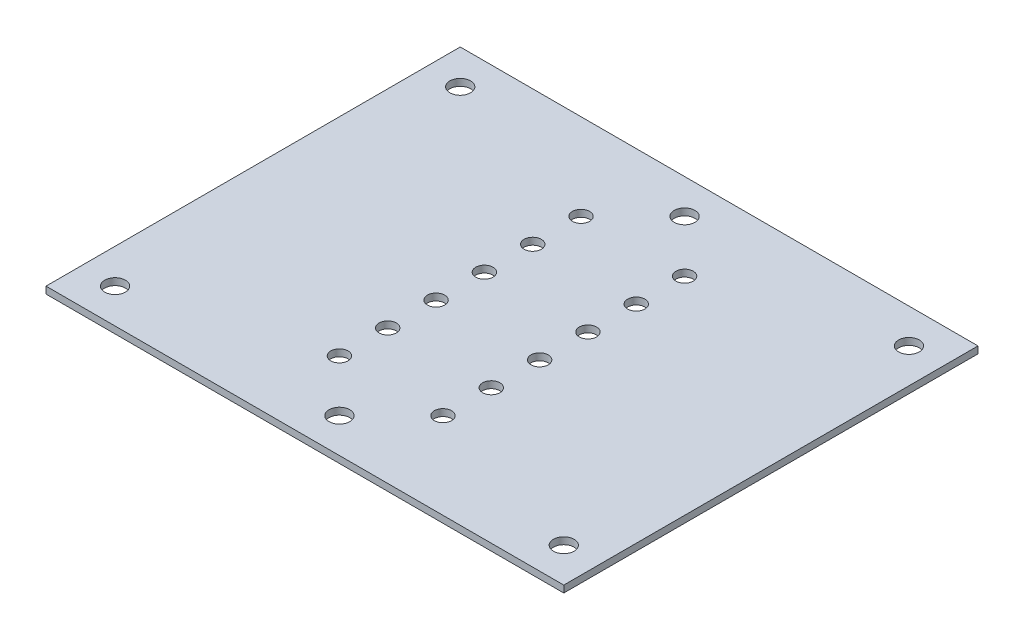
ISO-10303-21;
HEADER;
FILE_DESCRIPTION(('STEP AP214'),'2;1');
FILE_NAME('part.step','',(''),(''),'','','');
FILE_SCHEMA(('AUTOMOTIVE_DESIGN { 1 0 10303 214 1 1 1 1 }'));
ENDSEC;
DATA;
#1=APPLICATION_CONTEXT('core data for automotive mechanical design processes');
#2=APPLICATION_PROTOCOL_DEFINITION('international standard','automotive_design',2000,#1);
#3=PRODUCT_CONTEXT('',#1,'mechanical');
#4=PRODUCT('Part','Part','',(#3));
#5=PRODUCT_RELATED_PRODUCT_CATEGORY('part','',(#4));
#6=PRODUCT_DEFINITION_FORMATION('','',#4);
#7=PRODUCT_DEFINITION_CONTEXT('part definition',#1,'design');
#8=PRODUCT_DEFINITION('design','',#6,#7);
#9=PRODUCT_DEFINITION_SHAPE('','',#8);
#10=(LENGTH_UNIT() NAMED_UNIT(*) SI_UNIT(.MILLI.,.METRE.));
#11=(NAMED_UNIT(*) PLANE_ANGLE_UNIT() SI_UNIT($,.RADIAN.));
#12=(NAMED_UNIT(*) SI_UNIT($,.STERADIAN.) SOLID_ANGLE_UNIT());
#13=UNCERTAINTY_MEASURE_WITH_UNIT(LENGTH_MEASURE(1.E-05),#10,'distance_accuracy_value','');
#14=(GEOMETRIC_REPRESENTATION_CONTEXT(3) GLOBAL_UNCERTAINTY_ASSIGNED_CONTEXT((#13)) GLOBAL_UNIT_ASSIGNED_CONTEXT((#10,
#11,#12)) REPRESENTATION_CONTEXT('',''));
#15=CARTESIAN_POINT('',(0.,0.,0.));
#16=DIRECTION('',(0.,0.,1.));
#17=DIRECTION('',(1.,0.,0.));
#18=AXIS2_PLACEMENT_3D('',#15,#16,#17);
#19=CARTESIAN_POINT('',(37.5,1.,30.));
#20=DIRECTION('',(-1.,0.,0.));
#21=DIRECTION('',(0.,0.,1.));
#22=AXIS2_PLACEMENT_3D('',#19,#20,#21);
#23=PLANE('',#22);
#24=DIRECTION('',(0.,0.,-1.));
#25=VECTOR('',#24,1.);
#26=CARTESIAN_POINT('',(37.5,0.,30.));
#27=LINE('',#26,#25);
#28=CARTESIAN_POINT('',(37.5,0.,30.));
#29=VERTEX_POINT('',#28);
#30=CARTESIAN_POINT('',(37.5,0.,-30.));
#31=VERTEX_POINT('',#30);
#32=EDGE_CURVE('E97',#29,#31,#27,.T.);
#33=ORIENTED_EDGE('',*,*,#32,.T.);
#34=DIRECTION('',(0.,-1.,0.));
#35=VECTOR('',#34,1.);
#36=CARTESIAN_POINT('',(37.5,1.,-30.));
#37=LINE('',#36,#35);
#38=CARTESIAN_POINT('',(37.5,1.,-30.));
#39=VERTEX_POINT('',#38);
#40=EDGE_CURVE('E11',#39,#31,#37,.T.);
#41=ORIENTED_EDGE('',*,*,#40,.F.);
#42=DIRECTION('',(0.,0.,-1.));
#43=VECTOR('',#42,1.);
#44=CARTESIAN_POINT('',(37.5,1.,30.));
#45=LINE('',#44,#43);
#46=CARTESIAN_POINT('',(37.5,1.,30.));
#47=VERTEX_POINT('',#46);
#48=EDGE_CURVE('E85',#47,#39,#45,.T.);
#49=ORIENTED_EDGE('',*,*,#48,.F.);
#50=DIRECTION('',(0.,-1.,0.));
#51=VECTOR('',#50,1.);
#52=CARTESIAN_POINT('',(37.5,1.,30.));
#53=LINE('',#52,#51);
#54=EDGE_CURVE('E93',#47,#29,#53,.T.);
#55=ORIENTED_EDGE('',*,*,#54,.T.);
#56=EDGE_LOOP('',(#33,#41,#49,#55));
#57=FACE_BOUND('',#56,.T.);
#58=ADVANCED_FACE('F34',(#57),#23,.F.);
#59=CARTESIAN_POINT('',(-37.5,1.,-30.));
#60=DIRECTION('',(0.,0.,1.));
#61=DIRECTION('',(1.,0.,0.));
#62=AXIS2_PLACEMENT_3D('',#59,#60,#61);
#63=PLANE('',#62);
#64=DIRECTION('',(-1.,0.,0.));
#65=VECTOR('',#64,1.);
#66=CARTESIAN_POINT('',(-37.5,0.,-30.));
#67=LINE('',#66,#65);
#68=CARTESIAN_POINT('',(-37.5,0.,-30.));
#69=VERTEX_POINT('',#68);
#70=EDGE_CURVE('E89',#31,#69,#67,.T.);
#71=ORIENTED_EDGE('',*,*,#70,.T.);
#72=DIRECTION('',(0.,-1.,0.));
#73=VECTOR('',#72,1.);
#74=CARTESIAN_POINT('',(-37.5,1.,-30.));
#75=LINE('',#74,#73);
#76=CARTESIAN_POINT('',(-37.5,1.,-30.));
#77=VERTEX_POINT('',#76);
#78=EDGE_CURVE('E42',#77,#69,#75,.T.);
#79=ORIENTED_EDGE('',*,*,#78,.F.);
#80=DIRECTION('',(-1.,0.,0.));
#81=VECTOR('',#80,1.);
#82=CARTESIAN_POINT('',(-37.5,1.,-30.));
#83=LINE('',#82,#81);
#84=EDGE_CURVE('E80',#39,#77,#83,.T.);
#85=ORIENTED_EDGE('',*,*,#84,.F.);
#86=ORIENTED_EDGE('',*,*,#40,.T.);
#87=EDGE_LOOP('',(#71,#79,#85,#86));
#88=FACE_BOUND('',#87,.T.);
#89=ADVANCED_FACE('F88',(#88),#63,.F.);
#90=CARTESIAN_POINT('',(-37.5,1.,30.));
#91=DIRECTION('',(1.,0.,0.));
#92=DIRECTION('',(0.,0.,-1.));
#93=AXIS2_PLACEMENT_3D('',#90,#91,#92);
#94=PLANE('',#93);
#95=DIRECTION('',(0.,0.,1.));
#96=VECTOR('',#95,1.);
#97=CARTESIAN_POINT('',(-37.5,0.,30.));
#98=LINE('',#97,#96);
#99=CARTESIAN_POINT('',(-37.5,0.,30.));
#100=VERTEX_POINT('',#99);
#101=EDGE_CURVE('E67',#69,#100,#98,.T.);
#102=ORIENTED_EDGE('',*,*,#101,.T.);
#103=DIRECTION('',(0.,-1.,0.));
#104=VECTOR('',#103,1.);
#105=CARTESIAN_POINT('',(-37.5,1.,30.));
#106=LINE('',#105,#104);
#107=CARTESIAN_POINT('',(-37.5,1.,30.));
#108=VERTEX_POINT('',#107);
#109=EDGE_CURVE('E90',#108,#100,#106,.T.);
#110=ORIENTED_EDGE('',*,*,#109,.F.);
#111=DIRECTION('',(0.,0.,1.));
#112=VECTOR('',#111,1.);
#113=CARTESIAN_POINT('',(-37.5,1.,30.));
#114=LINE('',#113,#112);
#115=EDGE_CURVE('E83',#77,#108,#114,.T.);
#116=ORIENTED_EDGE('',*,*,#115,.F.);
#117=ORIENTED_EDGE('',*,*,#78,.T.);
#118=EDGE_LOOP('',(#102,#110,#116,#117));
#119=FACE_BOUND('',#118,.T.);
#120=ADVANCED_FACE('F91',(#119),#94,.F.);
#121=CARTESIAN_POINT('',(-37.5,1.,30.));
#122=DIRECTION('',(0.,0.,-1.));
#123=DIRECTION('',(-1.,0.,0.));
#124=AXIS2_PLACEMENT_3D('',#121,#122,#123);
#125=PLANE('',#124);
#126=DIRECTION('',(1.,0.,0.));
#127=VECTOR('',#126,1.);
#128=CARTESIAN_POINT('',(-37.5,0.,30.));
#129=LINE('',#128,#127);
#130=EDGE_CURVE('E73',#100,#29,#129,.T.);
#131=ORIENTED_EDGE('',*,*,#130,.T.);
#132=ORIENTED_EDGE('',*,*,#54,.F.);
#133=DIRECTION('',(1.,0.,0.));
#134=VECTOR('',#133,1.);
#135=CARTESIAN_POINT('',(-37.5,1.,30.));
#136=LINE('',#135,#134);
#137=EDGE_CURVE('E50',#108,#47,#136,.T.);
#138=ORIENTED_EDGE('',*,*,#137,.F.);
#139=ORIENTED_EDGE('',*,*,#109,.T.);
#140=EDGE_LOOP('',(#131,#132,#138,#139));
#141=FACE_BOUND('',#140,.T.);
#142=ADVANCED_FACE('F105',(#141),#125,.F.);
#143=CARTESIAN_POINT('',(0.,1.,0.));
#144=DIRECTION('',(0.,-1.,0.));
#145=DIRECTION('',(0.,0.,-1.));
#146=AXIS2_PLACEMENT_3D('',#143,#144,#145);
#147=PLANE('',#146);
#148=CARTESIAN_POINT('',(32.5,1.,25.));
#149=DIRECTION('',(0.,1.,0.));
#150=DIRECTION('',(0.,0.,1.));
#151=AXIS2_PLACEMENT_3D('',#148,#149,#150);
#152=CIRCLE('',#151,1.5);
#153=CARTESIAN_POINT('',(32.5,1.,26.5));
#154=VERTEX_POINT('',#153);
#155=EDGE_CURVE('E186',#154,#154,#152,.T.);
#156=ORIENTED_EDGE('',*,*,#155,.F.);
#157=EDGE_LOOP('',(#156));
#158=FACE_BOUND('',#157,.T.);
#159=CARTESIAN_POINT('',(-32.5,1.,25.));
#160=DIRECTION('',(0.,1.,0.));
#161=DIRECTION('',(0.,0.,-1.));
#162=AXIS2_PLACEMENT_3D('',#159,#160,#161);
#163=CIRCLE('',#162,1.5);
#164=CARTESIAN_POINT('',(-32.5,1.,23.5));
#165=VERTEX_POINT('',#164);
#166=EDGE_CURVE('E205',#165,#165,#163,.T.);
#167=ORIENTED_EDGE('',*,*,#166,.F.);
#168=EDGE_LOOP('',(#167));
#169=FACE_BOUND('',#168,.T.);
#170=CARTESIAN_POINT('',(32.5,1.,-25.));
#171=DIRECTION('',(0.,1.,0.));
#172=DIRECTION('',(0.,0.,-1.));
#173=AXIS2_PLACEMENT_3D('',#170,#171,#172);
#174=CIRCLE('',#173,1.5);
#175=CARTESIAN_POINT('',(32.5,1.,-26.5));
#176=VERTEX_POINT('',#175);
#177=EDGE_CURVE('E199',#176,#176,#174,.T.);
#178=ORIENTED_EDGE('',*,*,#177,.F.);
#179=EDGE_LOOP('',(#178));
#180=FACE_BOUND('',#179,.T.);
#181=CARTESIAN_POINT('',(0.,1.,-25.));
#182=DIRECTION('',(0.,1.,0.));
#183=DIRECTION('',(0.,0.,1.));
#184=AXIS2_PLACEMENT_3D('',#181,#182,#183);
#185=CIRCLE('',#184,1.5);
#186=CARTESIAN_POINT('',(0.,1.,-23.5));
#187=VERTEX_POINT('',#186);
#188=EDGE_CURVE('E192',#187,#187,#185,.T.);
#189=ORIENTED_EDGE('',*,*,#188,.F.);
#190=EDGE_LOOP('',(#189));
#191=FACE_BOUND('',#190,.T.);
#192=CARTESIAN_POINT('',(0.,1.,25.));
#193=DIRECTION('',(0.,1.,0.));
#194=DIRECTION('',(0.,0.,-1.));
#195=AXIS2_PLACEMENT_3D('',#192,#193,#194);
#196=CIRCLE('',#195,1.5);
#197=CARTESIAN_POINT('',(0.,1.,23.5));
#198=VERTEX_POINT('',#197);
#199=EDGE_CURVE('E193',#198,#198,#196,.T.);
#200=ORIENTED_EDGE('',*,*,#199,.F.);
#201=EDGE_LOOP('',(#200));
#202=FACE_BOUND('',#201,.T.);
#203=CARTESIAN_POINT('',(-32.5,1.,-25.));
#204=DIRECTION('',(0.,1.,0.));
#205=DIRECTION('',(0.,0.,1.));
#206=AXIS2_PLACEMENT_3D('',#203,#204,#205);
#207=CIRCLE('',#206,1.5);
#208=CARTESIAN_POINT('',(-32.5,1.,-23.5));
#209=VERTEX_POINT('',#208);
#210=EDGE_CURVE('E169',#209,#209,#207,.T.);
#211=ORIENTED_EDGE('',*,*,#210,.F.);
#212=EDGE_LOOP('',(#211));
#213=FACE_BOUND('',#212,.T.);
#214=CARTESIAN_POINT('',(-7.49999999999985,1.,-3.5));
#215=DIRECTION('',(0.,1.,0.));
#216=DIRECTION('',(0.,0.,1.));
#217=AXIS2_PLACEMENT_3D('',#214,#215,#216);
#218=CIRCLE('',#217,1.25);
#219=CARTESIAN_POINT('',(-7.49999999999985,1.,-2.25));
#220=VERTEX_POINT('',#219);
#221=EDGE_CURVE('E144',#220,#220,#218,.T.);
#222=ORIENTED_EDGE('',*,*,#221,.F.);
#223=EDGE_LOOP('',(#222));
#224=FACE_BOUND('',#223,.T.);
#225=CARTESIAN_POINT('',(-7.49999999999993,1.,-10.5));
#226=DIRECTION('',(0.,1.,0.));
#227=DIRECTION('',(0.,0.,1.));
#228=AXIS2_PLACEMENT_3D('',#225,#226,#227);
#229=CIRCLE('',#228,1.25);
#230=CARTESIAN_POINT('',(-7.49999999999993,1.,-9.25));
#231=VERTEX_POINT('',#230);
#232=EDGE_CURVE('E151',#231,#231,#229,.T.);
#233=ORIENTED_EDGE('',*,*,#232,.F.);
#234=EDGE_LOOP('',(#233));
#235=FACE_BOUND('',#234,.T.);
#236=CARTESIAN_POINT('',(7.50000000000034,1.,17.4999999999998));
#237=DIRECTION('',(0.,1.,0.));
#238=DIRECTION('',(0.,0.,1.));
#239=AXIS2_PLACEMENT_3D('',#236,#237,#238);
#240=CIRCLE('',#239,1.25000000000001);
#241=CARTESIAN_POINT('',(7.50000000000034,1.,18.7499999999998));
#242=VERTEX_POINT('',#241);
#243=EDGE_CURVE('E157',#242,#242,#240,.T.);
#244=ORIENTED_EDGE('',*,*,#243,.F.);
#245=EDGE_LOOP('',(#244));
#246=FACE_BOUND('',#245,.T.);
#247=CARTESIAN_POINT('',(7.50000000000028,1.,10.4999999999998));
#248=DIRECTION('',(0.,1.,0.));
#249=DIRECTION('',(0.,0.,1.));
#250=AXIS2_PLACEMENT_3D('',#247,#248,#249);
#251=CIRCLE('',#250,1.25000000000001);
#252=CARTESIAN_POINT('',(7.50000000000028,1.,11.7499999999998));
#253=VERTEX_POINT('',#252);
#254=EDGE_CURVE('E121',#253,#253,#251,.T.);
#255=ORIENTED_EDGE('',*,*,#254,.F.);
#256=EDGE_LOOP('',(#255));
#257=FACE_BOUND('',#256,.T.);
#258=CARTESIAN_POINT('',(7.5000000000002,1.,3.49999999999979));
#259=DIRECTION('',(0.,1.,0.));
#260=DIRECTION('',(0.,0.,1.));
#261=AXIS2_PLACEMENT_3D('',#258,#259,#260);
#262=CIRCLE('',#261,1.25000000000001);
#263=CARTESIAN_POINT('',(7.5000000000002,1.,4.7499999999998));
#264=VERTEX_POINT('',#263);
#265=EDGE_CURVE('E120',#264,#264,#262,.T.);
#266=ORIENTED_EDGE('',*,*,#265,.F.);
#267=EDGE_LOOP('',(#266));
#268=FACE_BOUND('',#267,.T.);
#269=CARTESIAN_POINT('',(7.50000000000015,1.,-3.50000000000021));
#270=DIRECTION('',(0.,1.,0.));
#271=DIRECTION('',(0.,0.,1.));
#272=AXIS2_PLACEMENT_3D('',#269,#270,#271);
#273=CIRCLE('',#272,1.25000000000001);
#274=CARTESIAN_POINT('',(7.50000000000015,1.,-2.2500000000002));
#275=VERTEX_POINT('',#274);
#276=EDGE_CURVE('E127',#275,#275,#273,.T.);
#277=ORIENTED_EDGE('',*,*,#276,.F.);
#278=EDGE_LOOP('',(#277));
#279=FACE_BOUND('',#278,.T.);
#280=CARTESIAN_POINT('',(7.50000000000006,1.,-10.5000000000002));
#281=DIRECTION('',(0.,1.,0.));
#282=DIRECTION('',(0.,0.,1.));
#283=AXIS2_PLACEMENT_3D('',#280,#281,#282);
#284=CIRCLE('',#283,1.25000000000001);
#285=CARTESIAN_POINT('',(7.50000000000006,1.,-9.2500000000002));
#286=VERTEX_POINT('',#285);
#287=EDGE_CURVE('E133',#286,#286,#284,.T.);
#288=ORIENTED_EDGE('',*,*,#287,.F.);
#289=EDGE_LOOP('',(#288));
#290=FACE_BOUND('',#289,.T.);
#291=CARTESIAN_POINT('',(7.49999999999998,1.,-17.5000000000002));
#292=DIRECTION('',(0.,1.,0.));
#293=DIRECTION('',(0.,0.,1.));
#294=AXIS2_PLACEMENT_3D('',#291,#292,#293);
#295=CIRCLE('',#294,1.25000000000001);
#296=CARTESIAN_POINT('',(7.49999999999998,1.,-16.2500000000002));
#297=VERTEX_POINT('',#296);
#298=EDGE_CURVE('E114',#297,#297,#295,.T.);
#299=ORIENTED_EDGE('',*,*,#298,.F.);
#300=EDGE_LOOP('',(#299));
#301=FACE_BOUND('',#300,.T.);
#302=CARTESIAN_POINT('',(-7.49999999999978,1.,3.5));
#303=DIRECTION('',(0.,1.,0.));
#304=DIRECTION('',(0.,0.,1.));
#305=AXIS2_PLACEMENT_3D('',#302,#303,#304);
#306=CIRCLE('',#305,1.25);
#307=CARTESIAN_POINT('',(-7.49999999999978,1.,4.75));
#308=VERTEX_POINT('',#307);
#309=EDGE_CURVE('E145',#308,#308,#306,.T.);
#310=ORIENTED_EDGE('',*,*,#309,.F.);
#311=EDGE_LOOP('',(#310));
#312=FACE_BOUND('',#311,.T.);
#313=CARTESIAN_POINT('',(-7.49999999999971,1.,10.5));
#314=DIRECTION('',(0.,1.,0.));
#315=DIRECTION('',(0.,0.,1.));
#316=AXIS2_PLACEMENT_3D('',#313,#314,#315);
#317=CIRCLE('',#316,1.25);
#318=CARTESIAN_POINT('',(-7.49999999999971,1.,11.75));
#319=VERTEX_POINT('',#318);
#320=EDGE_CURVE('E175',#319,#319,#317,.T.);
#321=ORIENTED_EDGE('',*,*,#320,.F.);
#322=EDGE_LOOP('',(#321));
#323=FACE_BOUND('',#322,.T.);
#324=CARTESIAN_POINT('',(-7.49999999999963,1.,17.5));
#325=DIRECTION('',(0.,1.,0.));
#326=DIRECTION('',(0.,0.,1.));
#327=AXIS2_PLACEMENT_3D('',#324,#325,#326);
#328=CIRCLE('',#327,1.25);
#329=CARTESIAN_POINT('',(-7.49999999999963,1.,18.75));
#330=VERTEX_POINT('',#329);
#331=EDGE_CURVE('E168',#330,#330,#328,.T.);
#332=ORIENTED_EDGE('',*,*,#331,.F.);
#333=EDGE_LOOP('',(#332));
#334=FACE_BOUND('',#333,.T.);
#335=CARTESIAN_POINT('',(-7.5,1.,-17.5));
#336=DIRECTION('',(0.,1.,0.));
#337=DIRECTION('',(0.,0.,1.));
#338=AXIS2_PLACEMENT_3D('',#335,#336,#337);
#339=CIRCLE('',#338,1.25);
#340=CARTESIAN_POINT('',(-7.5,1.,-16.25));
#341=VERTEX_POINT('',#340);
#342=EDGE_CURVE('E100',#341,#341,#339,.T.);
#343=ORIENTED_EDGE('',*,*,#342,.F.);
#344=EDGE_LOOP('',(#343));
#345=FACE_BOUND('',#344,.T.);
#346=ORIENTED_EDGE('',*,*,#48,.T.);
#347=ORIENTED_EDGE('',*,*,#84,.T.);
#348=ORIENTED_EDGE('',*,*,#115,.T.);
#349=ORIENTED_EDGE('',*,*,#137,.T.);
#350=EDGE_LOOP('',(#346,#347,#348,#349));
#351=FACE_BOUND('',#350,.T.);
#352=ADVANCED_FACE('F81',(#158,#169,#180,#191,#202,#213,#224,#235,#246,#257,#268,#279,#290,#301,
#312,#323,#334,#345,#351),#147,.F.);
#353=CARTESIAN_POINT('',(0.,0.,0.));
#354=DIRECTION('',(0.,-1.,0.));
#355=DIRECTION('',(0.,0.,-1.));
#356=AXIS2_PLACEMENT_3D('',#353,#354,#355);
#357=PLANE('',#356);
#358=CARTESIAN_POINT('',(32.5,0.,25.));
#359=DIRECTION('',(0.,1.,0.));
#360=DIRECTION('',(0.,0.,1.));
#361=AXIS2_PLACEMENT_3D('',#358,#359,#360);
#362=CIRCLE('',#361,1.5);
#363=CARTESIAN_POINT('',(32.5,0.,26.5));
#364=VERTEX_POINT('',#363);
#365=EDGE_CURVE('E208',#364,#364,#362,.T.);
#366=ORIENTED_EDGE('',*,*,#365,.T.);
#367=EDGE_LOOP('',(#366));
#368=FACE_BOUND('',#367,.T.);
#369=CARTESIAN_POINT('',(-32.5,0.,25.));
#370=DIRECTION('',(0.,1.,0.));
#371=DIRECTION('',(0.,0.,-1.));
#372=AXIS2_PLACEMENT_3D('',#369,#370,#371);
#373=CIRCLE('',#372,1.5);
#374=CARTESIAN_POINT('',(-32.5,0.,23.5));
#375=VERTEX_POINT('',#374);
#376=EDGE_CURVE('E202',#375,#375,#373,.T.);
#377=ORIENTED_EDGE('',*,*,#376,.T.);
#378=EDGE_LOOP('',(#377));
#379=FACE_BOUND('',#378,.T.);
#380=CARTESIAN_POINT('',(32.5,0.,-25.));
#381=DIRECTION('',(0.,1.,0.));
#382=DIRECTION('',(0.,0.,-1.));
#383=AXIS2_PLACEMENT_3D('',#380,#381,#382);
#384=CIRCLE('',#383,1.5);
#385=CARTESIAN_POINT('',(32.5,0.,-26.5));
#386=VERTEX_POINT('',#385);
#387=EDGE_CURVE('E196',#386,#386,#384,.T.);
#388=ORIENTED_EDGE('',*,*,#387,.T.);
#389=EDGE_LOOP('',(#388));
#390=FACE_BOUND('',#389,.T.);
#391=CARTESIAN_POINT('',(0.,0.,-25.));
#392=DIRECTION('',(0.,1.,0.));
#393=DIRECTION('',(0.,0.,1.));
#394=AXIS2_PLACEMENT_3D('',#391,#392,#393);
#395=CIRCLE('',#394,1.5);
#396=CARTESIAN_POINT('',(0.,0.,-23.5));
#397=VERTEX_POINT('',#396);
#398=EDGE_CURVE('E189',#397,#397,#395,.T.);
#399=ORIENTED_EDGE('',*,*,#398,.T.);
#400=EDGE_LOOP('',(#399));
#401=FACE_BOUND('',#400,.T.);
#402=CARTESIAN_POINT('',(0.,0.,25.));
#403=DIRECTION('',(0.,1.,0.));
#404=DIRECTION('',(0.,0.,-1.));
#405=AXIS2_PLACEMENT_3D('',#402,#403,#404);
#406=CIRCLE('',#405,1.5);
#407=CARTESIAN_POINT('',(0.,0.,23.5));
#408=VERTEX_POINT('',#407);
#409=EDGE_CURVE('E213',#408,#408,#406,.T.);
#410=ORIENTED_EDGE('',*,*,#409,.T.);
#411=EDGE_LOOP('',(#410));
#412=FACE_BOUND('',#411,.T.);
#413=CARTESIAN_POINT('',(-32.5,0.,-25.));
#414=DIRECTION('',(0.,1.,0.));
#415=DIRECTION('',(0.,0.,1.));
#416=AXIS2_PLACEMENT_3D('',#413,#414,#415);
#417=CIRCLE('',#416,1.5);
#418=CARTESIAN_POINT('',(-32.5,0.,-23.5));
#419=VERTEX_POINT('',#418);
#420=EDGE_CURVE('E183',#419,#419,#417,.T.);
#421=ORIENTED_EDGE('',*,*,#420,.T.);
#422=EDGE_LOOP('',(#421));
#423=FACE_BOUND('',#422,.T.);
#424=CARTESIAN_POINT('',(-7.49999999999985,0.,-3.5));
#425=DIRECTION('',(0.,1.,0.));
#426=DIRECTION('',(0.,0.,1.));
#427=AXIS2_PLACEMENT_3D('',#424,#425,#426);
#428=CIRCLE('',#427,1.25);
#429=CARTESIAN_POINT('',(-7.49999999999985,0.,-2.25));
#430=VERTEX_POINT('',#429);
#431=EDGE_CURVE('E141',#430,#430,#428,.T.);
#432=ORIENTED_EDGE('',*,*,#431,.T.);
#433=EDGE_LOOP('',(#432));
#434=FACE_BOUND('',#433,.T.);
#435=CARTESIAN_POINT('',(-7.49999999999993,0.,-10.5));
#436=DIRECTION('',(0.,1.,0.));
#437=DIRECTION('',(0.,0.,1.));
#438=AXIS2_PLACEMENT_3D('',#435,#436,#437);
#439=CIRCLE('',#438,1.25);
#440=CARTESIAN_POINT('',(-7.49999999999993,0.,-9.25));
#441=VERTEX_POINT('',#440);
#442=EDGE_CURVE('E148',#441,#441,#439,.T.);
#443=ORIENTED_EDGE('',*,*,#442,.T.);
#444=EDGE_LOOP('',(#443));
#445=FACE_BOUND('',#444,.T.);
#446=CARTESIAN_POINT('',(7.50000000000034,0.,17.4999999999998));
#447=DIRECTION('',(0.,1.,0.));
#448=DIRECTION('',(0.,0.,1.));
#449=AXIS2_PLACEMENT_3D('',#446,#447,#448);
#450=CIRCLE('',#449,1.25000000000001);
#451=CARTESIAN_POINT('',(7.50000000000034,0.,18.7499999999998));
#452=VERTEX_POINT('',#451);
#453=EDGE_CURVE('E154',#452,#452,#450,.T.);
#454=ORIENTED_EDGE('',*,*,#453,.T.);
#455=EDGE_LOOP('',(#454));
#456=FACE_BOUND('',#455,.T.);
#457=CARTESIAN_POINT('',(7.50000000000028,0.,10.4999999999998));
#458=DIRECTION('',(0.,1.,0.));
#459=DIRECTION('',(0.,0.,1.));
#460=AXIS2_PLACEMENT_3D('',#457,#458,#459);
#461=CIRCLE('',#460,1.25000000000001);
#462=CARTESIAN_POINT('',(7.50000000000028,0.,11.7499999999998));
#463=VERTEX_POINT('',#462);
#464=EDGE_CURVE('E160',#463,#463,#461,.T.);
#465=ORIENTED_EDGE('',*,*,#464,.T.);
#466=EDGE_LOOP('',(#465));
#467=FACE_BOUND('',#466,.T.);
#468=CARTESIAN_POINT('',(7.5000000000002,0.,3.49999999999979));
#469=DIRECTION('',(0.,1.,0.));
#470=DIRECTION('',(0.,0.,1.));
#471=AXIS2_PLACEMENT_3D('',#468,#469,#470);
#472=CIRCLE('',#471,1.25000000000001);
#473=CARTESIAN_POINT('',(7.5000000000002,0.,4.7499999999998));
#474=VERTEX_POINT('',#473);
#475=EDGE_CURVE('E117',#474,#474,#472,.T.);
#476=ORIENTED_EDGE('',*,*,#475,.T.);
#477=EDGE_LOOP('',(#476));
#478=FACE_BOUND('',#477,.T.);
#479=CARTESIAN_POINT('',(7.50000000000015,0.,-3.50000000000021));
#480=DIRECTION('',(0.,1.,0.));
#481=DIRECTION('',(0.,0.,1.));
#482=AXIS2_PLACEMENT_3D('',#479,#480,#481);
#483=CIRCLE('',#482,1.25000000000001);
#484=CARTESIAN_POINT('',(7.50000000000015,0.,-2.2500000000002));
#485=VERTEX_POINT('',#484);
#486=EDGE_CURVE('E124',#485,#485,#483,.T.);
#487=ORIENTED_EDGE('',*,*,#486,.T.);
#488=EDGE_LOOP('',(#487));
#489=FACE_BOUND('',#488,.T.);
#490=CARTESIAN_POINT('',(7.50000000000006,0.,-10.5000000000002));
#491=DIRECTION('',(0.,1.,0.));
#492=DIRECTION('',(0.,0.,1.));
#493=AXIS2_PLACEMENT_3D('',#490,#491,#492);
#494=CIRCLE('',#493,1.25000000000001);
#495=CARTESIAN_POINT('',(7.50000000000006,0.,-9.2500000000002));
#496=VERTEX_POINT('',#495);
#497=EDGE_CURVE('E130',#496,#496,#494,.T.);
#498=ORIENTED_EDGE('',*,*,#497,.T.);
#499=EDGE_LOOP('',(#498));
#500=FACE_BOUND('',#499,.T.);
#501=CARTESIAN_POINT('',(7.49999999999998,0.,-17.5000000000002));
#502=DIRECTION('',(0.,1.,0.));
#503=DIRECTION('',(0.,0.,1.));
#504=AXIS2_PLACEMENT_3D('',#501,#502,#503);
#505=CIRCLE('',#504,1.25000000000001);
#506=CARTESIAN_POINT('',(7.49999999999998,0.,-16.2500000000002));
#507=VERTEX_POINT('',#506);
#508=EDGE_CURVE('E136',#507,#507,#505,.T.);
#509=ORIENTED_EDGE('',*,*,#508,.T.);
#510=EDGE_LOOP('',(#509));
#511=FACE_BOUND('',#510,.T.);
#512=CARTESIAN_POINT('',(-7.49999999999978,0.,3.5));
#513=DIRECTION('',(0.,1.,0.));
#514=DIRECTION('',(0.,0.,1.));
#515=AXIS2_PLACEMENT_3D('',#512,#513,#514);
#516=CIRCLE('',#515,1.25);
#517=CARTESIAN_POINT('',(-7.49999999999978,0.,4.75));
#518=VERTEX_POINT('',#517);
#519=EDGE_CURVE('E178',#518,#518,#516,.T.);
#520=ORIENTED_EDGE('',*,*,#519,.T.);
#521=EDGE_LOOP('',(#520));
#522=FACE_BOUND('',#521,.T.);
#523=CARTESIAN_POINT('',(-7.49999999999971,0.,10.5));
#524=DIRECTION('',(0.,1.,0.));
#525=DIRECTION('',(0.,0.,1.));
#526=AXIS2_PLACEMENT_3D('',#523,#524,#525);
#527=CIRCLE('',#526,1.25);
#528=CARTESIAN_POINT('',(-7.49999999999971,0.,11.75));
#529=VERTEX_POINT('',#528);
#530=EDGE_CURVE('E172',#529,#529,#527,.T.);
#531=ORIENTED_EDGE('',*,*,#530,.T.);
#532=EDGE_LOOP('',(#531));
#533=FACE_BOUND('',#532,.T.);
#534=CARTESIAN_POINT('',(-7.49999999999963,0.,17.5));
#535=DIRECTION('',(0.,1.,0.));
#536=DIRECTION('',(0.,0.,1.));
#537=AXIS2_PLACEMENT_3D('',#534,#535,#536);
#538=CIRCLE('',#537,1.25);
#539=CARTESIAN_POINT('',(-7.49999999999963,0.,18.75));
#540=VERTEX_POINT('',#539);
#541=EDGE_CURVE('E165',#540,#540,#538,.T.);
#542=ORIENTED_EDGE('',*,*,#541,.T.);
#543=EDGE_LOOP('',(#542));
#544=FACE_BOUND('',#543,.T.);
#545=CARTESIAN_POINT('',(-7.5,0.,-17.5));
#546=DIRECTION('',(0.,1.,0.));
#547=DIRECTION('',(0.,0.,1.));
#548=AXIS2_PLACEMENT_3D('',#545,#546,#547);
#549=CIRCLE('',#548,1.25);
#550=CARTESIAN_POINT('',(-7.5,0.,-16.25));
#551=VERTEX_POINT('',#550);
#552=EDGE_CURVE('E111',#551,#551,#549,.T.);
#553=ORIENTED_EDGE('',*,*,#552,.T.);
#554=EDGE_LOOP('',(#553));
#555=FACE_BOUND('',#554,.T.);
#556=ORIENTED_EDGE('',*,*,#32,.F.);
#557=ORIENTED_EDGE('',*,*,#130,.F.);
#558=ORIENTED_EDGE('',*,*,#101,.F.);
#559=ORIENTED_EDGE('',*,*,#70,.F.);
#560=EDGE_LOOP('',(#556,#557,#558,#559));
#561=FACE_BOUND('',#560,.T.);
#562=ADVANCED_FACE('F108',(#368,#379,#390,#401,#412,#423,#434,#445,#456,#467,#478,#489,#500,
#511,#522,#533,#544,#555,#561),#357,.T.);
#563=CARTESIAN_POINT('',(-7.5,1.,-17.5));
#564=DIRECTION('',(0.,-1.,0.));
#565=DIRECTION('',(0.,0.,-1.));
#566=AXIS2_PLACEMENT_3D('',#563,#564,#565);
#567=CYLINDRICAL_SURFACE('',#566,1.25);
#568=ORIENTED_EDGE('',*,*,#342,.T.);
#569=EDGE_LOOP('',(#568));
#570=FACE_BOUND('',#569,.T.);
#571=ORIENTED_EDGE('',*,*,#552,.F.);
#572=EDGE_LOOP('',(#571));
#573=FACE_BOUND('',#572,.T.);
#574=ADVANCED_FACE('F252',(#570,#573),#567,.F.);
#575=CARTESIAN_POINT('',(-7.49999999999963,1.,17.5));
#576=DIRECTION('',(0.,-1.,0.));
#577=DIRECTION('',(0.,0.,-1.));
#578=AXIS2_PLACEMENT_3D('',#575,#576,#577);
#579=CYLINDRICAL_SURFACE('',#578,1.25);
#580=ORIENTED_EDGE('',*,*,#331,.T.);
#581=EDGE_LOOP('',(#580));
#582=FACE_BOUND('',#581,.T.);
#583=ORIENTED_EDGE('',*,*,#541,.F.);
#584=EDGE_LOOP('',(#583));
#585=FACE_BOUND('',#584,.T.);
#586=ADVANCED_FACE('F255',(#582,#585),#579,.F.);
#587=CARTESIAN_POINT('',(-7.49999999999971,1.,10.5));
#588=DIRECTION('',(0.,-1.,0.));
#589=DIRECTION('',(0.,0.,-1.));
#590=AXIS2_PLACEMENT_3D('',#587,#588,#589);
#591=CYLINDRICAL_SURFACE('',#590,1.25);
#592=ORIENTED_EDGE('',*,*,#320,.T.);
#593=EDGE_LOOP('',(#592));
#594=FACE_BOUND('',#593,.T.);
#595=ORIENTED_EDGE('',*,*,#530,.F.);
#596=EDGE_LOOP('',(#595));
#597=FACE_BOUND('',#596,.T.);
#598=ADVANCED_FACE('F363',(#594,#597),#591,.F.);
#599=CARTESIAN_POINT('',(-7.49999999999978,1.,3.5));
#600=DIRECTION('',(0.,-1.,0.));
#601=DIRECTION('',(0.,0.,-1.));
#602=AXIS2_PLACEMENT_3D('',#599,#600,#601);
#603=CYLINDRICAL_SURFACE('',#602,1.25);
#604=ORIENTED_EDGE('',*,*,#309,.T.);
#605=EDGE_LOOP('',(#604));
#606=FACE_BOUND('',#605,.T.);
#607=ORIENTED_EDGE('',*,*,#519,.F.);
#608=EDGE_LOOP('',(#607));
#609=FACE_BOUND('',#608,.T.);
#610=ADVANCED_FACE('F359',(#606,#609),#603,.F.);
#611=CARTESIAN_POINT('',(7.49999999999998,1.,-17.5000000000002));
#612=DIRECTION('',(0.,-1.,0.));
#613=DIRECTION('',(0.,0.,-1.));
#614=AXIS2_PLACEMENT_3D('',#611,#612,#613);
#615=CYLINDRICAL_SURFACE('',#614,1.25000000000001);
#616=ORIENTED_EDGE('',*,*,#298,.T.);
#617=EDGE_LOOP('',(#616));
#618=FACE_BOUND('',#617,.T.);
#619=ORIENTED_EDGE('',*,*,#508,.F.);
#620=EDGE_LOOP('',(#619));
#621=FACE_BOUND('',#620,.T.);
#622=ADVANCED_FACE('F362',(#618,#621),#615,.F.);
#623=CARTESIAN_POINT('',(7.50000000000006,1.,-10.5000000000002));
#624=DIRECTION('',(0.,-1.,0.));
#625=DIRECTION('',(0.,0.,-1.));
#626=AXIS2_PLACEMENT_3D('',#623,#624,#625);
#627=CYLINDRICAL_SURFACE('',#626,1.25000000000001);
#628=ORIENTED_EDGE('',*,*,#287,.T.);
#629=EDGE_LOOP('',(#628));
#630=FACE_BOUND('',#629,.T.);
#631=ORIENTED_EDGE('',*,*,#497,.F.);
#632=EDGE_LOOP('',(#631));
#633=FACE_BOUND('',#632,.T.);
#634=ADVANCED_FACE('F388',(#630,#633),#627,.F.);
#635=CARTESIAN_POINT('',(7.50000000000015,1.,-3.50000000000021));
#636=DIRECTION('',(0.,-1.,0.));
#637=DIRECTION('',(0.,0.,-1.));
#638=AXIS2_PLACEMENT_3D('',#635,#636,#637);
#639=CYLINDRICAL_SURFACE('',#638,1.25000000000001);
#640=ORIENTED_EDGE('',*,*,#276,.T.);
#641=EDGE_LOOP('',(#640));
#642=FACE_BOUND('',#641,.T.);
#643=ORIENTED_EDGE('',*,*,#486,.F.);
#644=EDGE_LOOP('',(#643));
#645=FACE_BOUND('',#644,.T.);
#646=ADVANCED_FACE('F392',(#642,#645),#639,.F.);
#647=CARTESIAN_POINT('',(7.5000000000002,1.,3.49999999999979));
#648=DIRECTION('',(0.,-1.,0.));
#649=DIRECTION('',(0.,0.,-1.));
#650=AXIS2_PLACEMENT_3D('',#647,#648,#649);
#651=CYLINDRICAL_SURFACE('',#650,1.25000000000001);
#652=ORIENTED_EDGE('',*,*,#265,.T.);
#653=EDGE_LOOP('',(#652));
#654=FACE_BOUND('',#653,.T.);
#655=ORIENTED_EDGE('',*,*,#475,.F.);
#656=EDGE_LOOP('',(#655));
#657=FACE_BOUND('',#656,.T.);
#658=ADVANCED_FACE('F375',(#654,#657),#651,.F.);
#659=CARTESIAN_POINT('',(7.50000000000028,1.,10.4999999999998));
#660=DIRECTION('',(0.,-1.,0.));
#661=DIRECTION('',(0.,0.,-1.));
#662=AXIS2_PLACEMENT_3D('',#659,#660,#661);
#663=CYLINDRICAL_SURFACE('',#662,1.25000000000001);
#664=ORIENTED_EDGE('',*,*,#254,.T.);
#665=EDGE_LOOP('',(#664));
#666=FACE_BOUND('',#665,.T.);
#667=ORIENTED_EDGE('',*,*,#464,.F.);
#668=EDGE_LOOP('',(#667));
#669=FACE_BOUND('',#668,.T.);
#670=ADVANCED_FACE('F371',(#666,#669),#663,.F.);
#671=CARTESIAN_POINT('',(7.50000000000034,1.,17.4999999999998));
#672=DIRECTION('',(0.,-1.,0.));
#673=DIRECTION('',(0.,0.,-1.));
#674=AXIS2_PLACEMENT_3D('',#671,#672,#673);
#675=CYLINDRICAL_SURFACE('',#674,1.25000000000001);
#676=ORIENTED_EDGE('',*,*,#243,.T.);
#677=EDGE_LOOP('',(#676));
#678=FACE_BOUND('',#677,.T.);
#679=ORIENTED_EDGE('',*,*,#453,.F.);
#680=EDGE_LOOP('',(#679));
#681=FACE_BOUND('',#680,.T.);
#682=ADVANCED_FACE('F374',(#678,#681),#675,.F.);
#683=CARTESIAN_POINT('',(-7.49999999999993,1.,-10.5));
#684=DIRECTION('',(0.,-1.,0.));
#685=DIRECTION('',(0.,0.,-1.));
#686=AXIS2_PLACEMENT_3D('',#683,#684,#685);
#687=CYLINDRICAL_SURFACE('',#686,1.25);
#688=ORIENTED_EDGE('',*,*,#232,.T.);
#689=EDGE_LOOP('',(#688));
#690=FACE_BOUND('',#689,.T.);
#691=ORIENTED_EDGE('',*,*,#442,.F.);
#692=EDGE_LOOP('',(#691));
#693=FACE_BOUND('',#692,.T.);
#694=ADVANCED_FACE('F379',(#690,#693),#687,.F.);
#695=CARTESIAN_POINT('',(-7.49999999999985,1.,-3.5));
#696=DIRECTION('',(0.,-1.,0.));
#697=DIRECTION('',(0.,0.,-1.));
#698=AXIS2_PLACEMENT_3D('',#695,#696,#697);
#699=CYLINDRICAL_SURFACE('',#698,1.25);
#700=ORIENTED_EDGE('',*,*,#221,.T.);
#701=EDGE_LOOP('',(#700));
#702=FACE_BOUND('',#701,.T.);
#703=ORIENTED_EDGE('',*,*,#431,.F.);
#704=EDGE_LOOP('',(#703));
#705=FACE_BOUND('',#704,.T.);
#706=ADVANCED_FACE('F290',(#702,#705),#699,.F.);
#707=CARTESIAN_POINT('',(-32.5,1.,-25.));
#708=DIRECTION('',(0.,-1.,0.));
#709=DIRECTION('',(0.,0.,-1.));
#710=AXIS2_PLACEMENT_3D('',#707,#708,#709);
#711=CYLINDRICAL_SURFACE('',#710,1.5);
#712=ORIENTED_EDGE('',*,*,#210,.T.);
#713=EDGE_LOOP('',(#712));
#714=FACE_BOUND('',#713,.T.);
#715=ORIENTED_EDGE('',*,*,#420,.F.);
#716=EDGE_LOOP('',(#715));
#717=FACE_BOUND('',#716,.T.);
#718=ADVANCED_FACE('F300',(#714,#717),#711,.F.);
#719=CARTESIAN_POINT('',(0.,1.,25.));
#720=DIRECTION('',(0.,-1.,0.));
#721=DIRECTION('',(0.,0.,-1.));
#722=AXIS2_PLACEMENT_3D('',#719,#720,#721);
#723=CYLINDRICAL_SURFACE('',#722,1.5);
#724=ORIENTED_EDGE('',*,*,#199,.T.);
#725=EDGE_LOOP('',(#724));
#726=FACE_BOUND('',#725,.T.);
#727=ORIENTED_EDGE('',*,*,#409,.F.);
#728=EDGE_LOOP('',(#727));
#729=FACE_BOUND('',#728,.T.);
#730=ADVANCED_FACE('F219',(#726,#729),#723,.F.);
#731=CARTESIAN_POINT('',(0.,1.,-25.));
#732=DIRECTION('',(0.,-1.,0.));
#733=DIRECTION('',(0.,0.,-1.));
#734=AXIS2_PLACEMENT_3D('',#731,#732,#733);
#735=CYLINDRICAL_SURFACE('',#734,1.5);
#736=ORIENTED_EDGE('',*,*,#188,.T.);
#737=EDGE_LOOP('',(#736));
#738=FACE_BOUND('',#737,.T.);
#739=ORIENTED_EDGE('',*,*,#398,.F.);
#740=EDGE_LOOP('',(#739));
#741=FACE_BOUND('',#740,.T.);
#742=ADVANCED_FACE('F314',(#738,#741),#735,.F.);
#743=CARTESIAN_POINT('',(32.5,1.,-25.));
#744=DIRECTION('',(0.,-1.,0.));
#745=DIRECTION('',(0.,0.,-1.));
#746=AXIS2_PLACEMENT_3D('',#743,#744,#745);
#747=CYLINDRICAL_SURFACE('',#746,1.5);
#748=ORIENTED_EDGE('',*,*,#177,.T.);
#749=EDGE_LOOP('',(#748));
#750=FACE_BOUND('',#749,.T.);
#751=ORIENTED_EDGE('',*,*,#387,.F.);
#752=EDGE_LOOP('',(#751));
#753=FACE_BOUND('',#752,.T.);
#754=ADVANCED_FACE('F323',(#750,#753),#747,.F.);
#755=CARTESIAN_POINT('',(-32.5,1.,25.));
#756=DIRECTION('',(0.,-1.,0.));
#757=DIRECTION('',(0.,0.,-1.));
#758=AXIS2_PLACEMENT_3D('',#755,#756,#757);
#759=CYLINDRICAL_SURFACE('',#758,1.5);
#760=ORIENTED_EDGE('',*,*,#166,.T.);
#761=EDGE_LOOP('',(#760));
#762=FACE_BOUND('',#761,.T.);
#763=ORIENTED_EDGE('',*,*,#376,.F.);
#764=EDGE_LOOP('',(#763));
#765=FACE_BOUND('',#764,.T.);
#766=ADVANCED_FACE('F333',(#762,#765),#759,.F.);
#767=CARTESIAN_POINT('',(32.5,1.,25.));
#768=DIRECTION('',(0.,-1.,0.));
#769=DIRECTION('',(0.,0.,-1.));
#770=AXIS2_PLACEMENT_3D('',#767,#768,#769);
#771=CYLINDRICAL_SURFACE('',#770,1.5);
#772=ORIENTED_EDGE('',*,*,#155,.T.);
#773=EDGE_LOOP('',(#772));
#774=FACE_BOUND('',#773,.T.);
#775=ORIENTED_EDGE('',*,*,#365,.F.);
#776=EDGE_LOOP('',(#775));
#777=FACE_BOUND('',#776,.T.);
#778=ADVANCED_FACE('F343',(#774,#777),#771,.F.);
#779=CLOSED_SHELL('',(#58,#89,#120,#142,#352,#562,#574,#586,#598,#610,#622,#634,#646,#658,#670,
#682,#694,#706,#718,#730,#742,#754,#766,#778));
#780=MANIFOLD_SOLID_BREP('B2',#779);
#781=ADVANCED_BREP_SHAPE_REPRESENTATION('',(#18,#780),#14);
#782=SHAPE_DEFINITION_REPRESENTATION(#9,#781);
ENDSEC;
END-ISO-10303-21;
